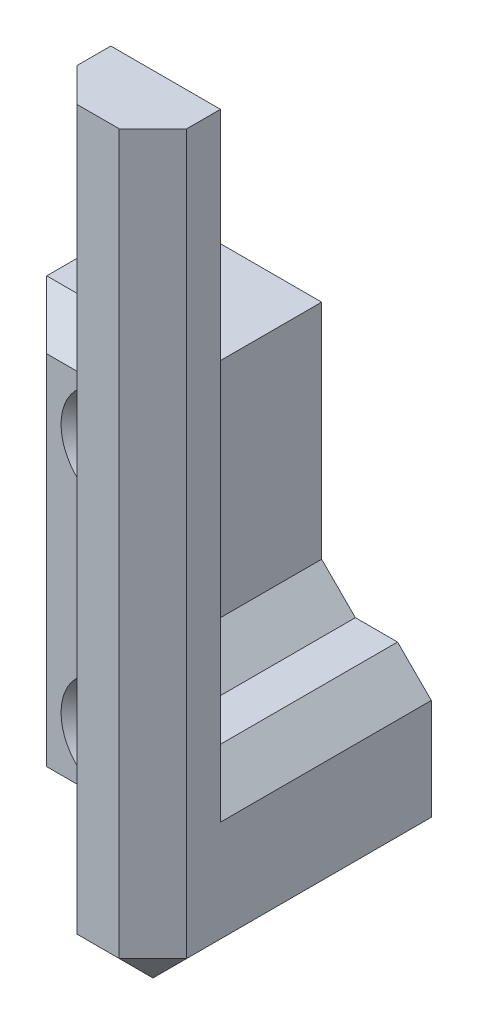
ISO-10303-21;
HEADER;
FILE_DESCRIPTION(('STEP AP214'),'2;1');
FILE_NAME('part.step','',(''),(''),'','','');
FILE_SCHEMA(('AUTOMOTIVE_DESIGN { 1 0 10303 214 1 1 1 1 }'));
ENDSEC;
DATA;
#1=APPLICATION_CONTEXT('core data for automotive mechanical design processes');
#2=APPLICATION_PROTOCOL_DEFINITION('international standard','automotive_design',2000,#1);
#3=PRODUCT_CONTEXT('',#1,'mechanical');
#4=PRODUCT('Part','Part','',(#3));
#5=PRODUCT_RELATED_PRODUCT_CATEGORY('part','',(#4));
#6=PRODUCT_DEFINITION_FORMATION('','',#4);
#7=PRODUCT_DEFINITION_CONTEXT('part definition',#1,'design');
#8=PRODUCT_DEFINITION('design','',#6,#7);
#9=PRODUCT_DEFINITION_SHAPE('','',#8);
#10=(LENGTH_UNIT() NAMED_UNIT(*) SI_UNIT(.MILLI.,.METRE.));
#11=(NAMED_UNIT(*) PLANE_ANGLE_UNIT() SI_UNIT($,.RADIAN.));
#12=(NAMED_UNIT(*) SI_UNIT($,.STERADIAN.) SOLID_ANGLE_UNIT());
#13=UNCERTAINTY_MEASURE_WITH_UNIT(LENGTH_MEASURE(1.E-05),#10,'distance_accuracy_value','');
#14=(GEOMETRIC_REPRESENTATION_CONTEXT(3) GLOBAL_UNCERTAINTY_ASSIGNED_CONTEXT((#13)) GLOBAL_UNIT_ASSIGNED_CONTEXT((#10,
#11,#12)) REPRESENTATION_CONTEXT('',''));
#15=CARTESIAN_POINT('',(0.,0.,0.));
#16=DIRECTION('',(0.,0.,1.));
#17=DIRECTION('',(1.,0.,0.));
#18=AXIS2_PLACEMENT_3D('',#15,#16,#17);
#19=CARTESIAN_POINT('',(9.5,0.,8.8));
#20=DIRECTION('',(-1.,0.,0.));
#21=DIRECTION('',(0.,0.,1.));
#22=AXIS2_PLACEMENT_3D('',#19,#20,#21);
#23=PLANE('',#22);
#24=DIRECTION('',(0.,1.,0.));
#25=VECTOR('',#24,1.);
#26=CARTESIAN_POINT('',(9.5,0.,8.8));
#27=LINE('',#26,#25);
#28=CARTESIAN_POINT('',(9.5,12.,8.8));
#29=VERTEX_POINT('',#28);
#30=CARTESIAN_POINT('',(9.5,23.2,8.8));
#31=VERTEX_POINT('',#30);
#32=EDGE_CURVE('E234',#29,#31,#27,.T.);
#33=ORIENTED_EDGE('',*,*,#32,.F.);
#34=DIRECTION('',(0.,0.,-1.));
#35=VECTOR('',#34,1.);
#36=CARTESIAN_POINT('',(9.5,12.,8.8));
#37=LINE('',#36,#35);
#38=CARTESIAN_POINT('',(9.5,12.,0.));
#39=VERTEX_POINT('',#38);
#40=EDGE_CURVE('E272',#29,#39,#37,.T.);
#41=ORIENTED_EDGE('',*,*,#40,.T.);
#42=DIRECTION('',(0.,1.,0.));
#43=VECTOR('',#42,1.);
#44=CARTESIAN_POINT('',(9.5,0.,0.));
#45=LINE('',#44,#43);
#46=CARTESIAN_POINT('',(9.5,25.2,0.));
#47=VERTEX_POINT('',#46);
#48=EDGE_CURVE('E242',#39,#47,#45,.T.);
#49=ORIENTED_EDGE('',*,*,#48,.T.);
#50=DIRECTION('',(0.,0.,-1.));
#51=VECTOR('',#50,1.);
#52=CARTESIAN_POINT('',(9.5,25.2,8.8));
#53=LINE('',#52,#51);
#54=CARTESIAN_POINT('',(9.5,25.2,6.79999999999999));
#55=VERTEX_POINT('',#54);
#56=EDGE_CURVE('E252',#55,#47,#53,.T.);
#57=ORIENTED_EDGE('',*,*,#56,.F.);
#58=DIRECTION('',(0.,0.707106781186546,-0.707106781186549));
#59=VECTOR('',#58,1.);
#60=CARTESIAN_POINT('',(9.5,23.2,8.8));
#61=LINE('',#60,#59);
#62=EDGE_CURVE('E269',#55,#31,#61,.F.);
#63=ORIENTED_EDGE('',*,*,#62,.T.);
#64=EDGE_LOOP('',(#33,#41,#49,#57,#63));
#65=FACE_BOUND('',#64,.T.);
#66=ADVANCED_FACE('F47',(#65),#23,.F.);
#67=CARTESIAN_POINT('',(0.,0.,8.8));
#68=DIRECTION('',(0.,0.,-1.));
#69=DIRECTION('',(-1.,0.,0.));
#70=AXIS2_PLACEMENT_3D('',#67,#68,#69);
#71=PLANE('',#70);
#72=CARTESIAN_POINT('',(6.,5.2,8.8));
#73=DIRECTION('',(0.,0.,-1.));
#74=DIRECTION('',(-1.,0.,0.));
#75=AXIS2_PLACEMENT_3D('',#72,#73,#74);
#76=CIRCLE('',#75,3.15000000000001);
#77=CARTESIAN_POINT('',(2.84999999999999,5.2,8.8));
#78=VERTEX_POINT('',#77);
#79=EDGE_CURVE('E57',#78,#78,#76,.T.);
#80=ORIENTED_EDGE('',*,*,#79,.T.);
#81=EDGE_LOOP('',(#80));
#82=FACE_BOUND('',#81,.T.);
#83=CARTESIAN_POINT('',(6.,20.,8.8));
#84=DIRECTION('',(0.,0.,-1.));
#85=DIRECTION('',(-1.,0.,0.));
#86=AXIS2_PLACEMENT_3D('',#83,#84,#85);
#87=CIRCLE('',#86,3.15000000000001);
#88=CARTESIAN_POINT('',(2.84999999999999,20.,8.8));
#89=VERTEX_POINT('',#88);
#90=EDGE_CURVE('E383',#89,#89,#87,.T.);
#91=ORIENTED_EDGE('',*,*,#90,.T.);
#92=EDGE_LOOP('',(#91));
#93=FACE_BOUND('',#92,.T.);
#94=ORIENTED_EDGE('',*,*,#32,.T.);
#95=DIRECTION('',(-1.,0.,0.));
#96=VECTOR('',#95,1.);
#97=CARTESIAN_POINT('',(0.,23.2,8.8));
#98=LINE('',#97,#96);
#99=CARTESIAN_POINT('',(2.,23.2,8.8));
#100=VERTEX_POINT('',#99);
#101=EDGE_CURVE('E295',#31,#100,#98,.T.);
#102=ORIENTED_EDGE('',*,*,#101,.T.);
#103=DIRECTION('',(0.,-1.,0.));
#104=VECTOR('',#103,1.);
#105=CARTESIAN_POINT('',(2.,0.,8.8));
#106=LINE('',#105,#104);
#107=CARTESIAN_POINT('',(2.,2.,8.8));
#108=VERTEX_POINT('',#107);
#109=EDGE_CURVE('E289',#100,#108,#106,.T.);
#110=ORIENTED_EDGE('',*,*,#109,.T.);
#111=DIRECTION('',(1.,0.,0.));
#112=VECTOR('',#111,1.);
#113=CARTESIAN_POINT('',(0.,2.,8.8));
#114=LINE('',#113,#112);
#115=CARTESIAN_POINT('',(9.5,2.,8.8));
#116=VERTEX_POINT('',#115);
#117=EDGE_CURVE('E292',#108,#116,#114,.T.);
#118=ORIENTED_EDGE('',*,*,#117,.T.);
#119=CARTESIAN_POINT('',(9.5,10.,8.8));
#120=VERTEX_POINT('',#119);
#121=EDGE_CURVE('E230',#116,#120,#27,.T.);
#122=ORIENTED_EDGE('',*,*,#121,.T.);
#123=DIRECTION('',(-1.,0.,0.));
#124=VECTOR('',#123,1.);
#125=CARTESIAN_POINT('',(9.5,10.,8.8));
#126=LINE('',#125,#124);
#127=CARTESIAN_POINT('',(11.5,10.,8.8));
#128=VERTEX_POINT('',#127);
#129=EDGE_CURVE('E261',#128,#120,#126,.T.);
#130=ORIENTED_EDGE('',*,*,#129,.F.);
#131=DIRECTION('',(-0.707106781186551,0.707106781186544,0.));
#132=VECTOR('',#131,1.);
#133=CARTESIAN_POINT('',(10.7499999999999,10.7500000000001,8.8));
#134=LINE('',#133,#132);
#135=EDGE_CURVE('E335',#128,#29,#134,.T.);
#136=ORIENTED_EDGE('',*,*,#135,.T.);
#137=EDGE_LOOP('',(#94,#102,#110,#118,#122,#130,#136));
#138=FACE_BOUND('',#137,.T.);
#139=ADVANCED_FACE('F390',(#82,#93,#138),#71,.F.);
#140=CARTESIAN_POINT('',(0.,0.,0.));
#141=DIRECTION('',(0.,0.,-1.));
#142=DIRECTION('',(-1.,0.,0.));
#143=AXIS2_PLACEMENT_3D('',#140,#141,#142);
#144=PLANE('',#143);
#145=CARTESIAN_POINT('',(6.,20.,0.));
#146=DIRECTION('',(0.,0.,1.));
#147=DIRECTION('',(1.,0.,0.));
#148=AXIS2_PLACEMENT_3D('',#145,#146,#147);
#149=CIRCLE('',#148,1.6);
#150=CARTESIAN_POINT('',(7.6,20.,0.));
#151=VERTEX_POINT('',#150);
#152=EDGE_CURVE('E225',#151,#151,#149,.T.);
#153=ORIENTED_EDGE('',*,*,#152,.T.);
#154=EDGE_LOOP('',(#153));
#155=FACE_BOUND('',#154,.T.);
#156=DIRECTION('',(-1.,0.,0.));
#157=VECTOR('',#156,1.);
#158=CARTESIAN_POINT('',(9.5,10.,0.));
#159=LINE('',#158,#157);
#160=CARTESIAN_POINT('',(14.,10.,0.));
#161=VERTEX_POINT('',#160);
#162=CARTESIAN_POINT('',(11.5,10.,0.));
#163=VERTEX_POINT('',#162);
#164=EDGE_CURVE('E211',#161,#163,#159,.T.);
#165=ORIENTED_EDGE('',*,*,#164,.F.);
#166=DIRECTION('',(-0.707106781186549,0.707106781186546,0.));
#167=VECTOR('',#166,1.);
#168=CARTESIAN_POINT('',(12.,12.,0.));
#169=LINE('',#168,#167);
#170=CARTESIAN_POINT('',(16.,8.,0.));
#171=VERTEX_POINT('',#170);
#172=EDGE_CURVE('E286',#161,#171,#169,.F.);
#173=ORIENTED_EDGE('',*,*,#172,.T.);
#174=DIRECTION('',(0.,1.,0.));
#175=VECTOR('',#174,1.);
#176=CARTESIAN_POINT('',(16.,0.,0.));
#177=LINE('',#176,#175);
#178=CARTESIAN_POINT('',(16.,2.00000000000001,0.));
#179=VERTEX_POINT('',#178);
#180=EDGE_CURVE('E210',#179,#171,#177,.T.);
#181=ORIENTED_EDGE('',*,*,#180,.F.);
#182=DIRECTION('',(-0.707106781186546,-0.707106781186549,0.));
#183=VECTOR('',#182,1.);
#184=CARTESIAN_POINT('',(7.00000000000002,-7.,0.));
#185=LINE('',#184,#183);
#186=CARTESIAN_POINT('',(14.,0.,0.));
#187=VERTEX_POINT('',#186);
#188=EDGE_CURVE('E283',#179,#187,#185,.T.);
#189=ORIENTED_EDGE('',*,*,#188,.T.);
#190=DIRECTION('',(1.,0.,0.));
#191=VECTOR('',#190,1.);
#192=CARTESIAN_POINT('',(8.,0.,0.));
#193=LINE('',#192,#191);
#194=CARTESIAN_POINT('',(0.,0.,0.));
#195=VERTEX_POINT('',#194);
#196=EDGE_CURVE('E238',#195,#187,#193,.T.);
#197=ORIENTED_EDGE('',*,*,#196,.F.);
#198=DIRECTION('',(0.,-1.,0.));
#199=VECTOR('',#198,1.);
#200=CARTESIAN_POINT('',(0.,0.,0.));
#201=LINE('',#200,#199);
#202=CARTESIAN_POINT('',(0.,25.2,0.));
#203=VERTEX_POINT('',#202);
#204=EDGE_CURVE('E229',#203,#195,#201,.T.);
#205=ORIENTED_EDGE('',*,*,#204,.F.);
#206=DIRECTION('',(-1.,0.,0.));
#207=VECTOR('',#206,1.);
#208=CARTESIAN_POINT('',(0.,25.2,0.));
#209=LINE('',#208,#207);
#210=EDGE_CURVE('E246',#47,#203,#209,.T.);
#211=ORIENTED_EDGE('',*,*,#210,.F.);
#212=ORIENTED_EDGE('',*,*,#48,.F.);
#213=DIRECTION('',(0.707106781186551,-0.707106781186544,0.));
#214=VECTOR('',#213,1.);
#215=CARTESIAN_POINT('',(11.5,10.,0.));
#216=LINE('',#215,#214);
#217=EDGE_CURVE('E338',#39,#163,#216,.T.);
#218=ORIENTED_EDGE('',*,*,#217,.T.);
#219=EDGE_LOOP('',(#165,#173,#181,#189,#197,#205,#211,#212,#218));
#220=FACE_BOUND('',#219,.T.);
#221=CARTESIAN_POINT('',(6.,5.2,0.));
#222=DIRECTION('',(0.,0.,1.));
#223=DIRECTION('',(-1.,0.,0.));
#224=AXIS2_PLACEMENT_3D('',#221,#222,#223);
#225=CIRCLE('',#224,1.6);
#226=CARTESIAN_POINT('',(4.4,5.2,0.));
#227=VERTEX_POINT('',#226);
#228=EDGE_CURVE('E221',#227,#227,#225,.T.);
#229=ORIENTED_EDGE('',*,*,#228,.T.);
#230=EDGE_LOOP('',(#229));
#231=FACE_BOUND('',#230,.T.);
#232=ADVANCED_FACE('F407',(#155,#220,#231),#144,.T.);
#233=CARTESIAN_POINT('',(0.,0.,8.8));
#234=DIRECTION('',(1.,0.,0.));
#235=DIRECTION('',(0.,0.,-1.));
#236=AXIS2_PLACEMENT_3D('',#233,#234,#235);
#237=PLANE('',#236);
#238=DIRECTION('',(0.,0.,-1.));
#239=VECTOR('',#238,1.);
#240=CARTESIAN_POINT('',(0.,0.,8.8));
#241=LINE('',#240,#239);
#242=CARTESIAN_POINT('',(0.,0.,6.79999999999999));
#243=VERTEX_POINT('',#242);
#244=EDGE_CURVE('E255',#243,#195,#241,.T.);
#245=ORIENTED_EDGE('',*,*,#244,.F.);
#246=DIRECTION('',(0.,1.,0.));
#247=VECTOR('',#246,1.);
#248=CARTESIAN_POINT('',(0.,0.,6.79999999999999));
#249=LINE('',#248,#247);
#250=CARTESIAN_POINT('',(0.,25.2,6.79999999999999));
#251=VERTEX_POINT('',#250);
#252=EDGE_CURVE('E332',#243,#251,#249,.T.);
#253=ORIENTED_EDGE('',*,*,#252,.T.);
#254=DIRECTION('',(0.,0.,-1.));
#255=VECTOR('',#254,1.);
#256=CARTESIAN_POINT('',(0.,25.2,8.8));
#257=LINE('',#256,#255);
#258=EDGE_CURVE('E233',#251,#203,#257,.T.);
#259=ORIENTED_EDGE('',*,*,#258,.T.);
#260=ORIENTED_EDGE('',*,*,#204,.T.);
#261=EDGE_LOOP('',(#245,#253,#259,#260));
#262=FACE_BOUND('',#261,.T.);
#263=ADVANCED_FACE('F409',(#262),#237,.F.);
#264=CARTESIAN_POINT('',(8.,0.,8.8));
#265=DIRECTION('',(0.,1.,0.));
#266=DIRECTION('',(0.,0.,1.));
#267=AXIS2_PLACEMENT_3D('',#264,#265,#266);
#268=PLANE('',#267);
#269=ORIENTED_EDGE('',*,*,#196,.T.);
#270=DIRECTION('',(0.,0.,1.));
#271=VECTOR('',#270,1.);
#272=CARTESIAN_POINT('',(14.,0.,16.5));
#273=LINE('',#272,#271);
#274=CARTESIAN_POINT('',(14.,0.,14.5));
#275=VERTEX_POINT('',#274);
#276=EDGE_CURVE('E311',#187,#275,#273,.T.);
#277=ORIENTED_EDGE('',*,*,#276,.T.);
#278=DIRECTION('',(-1.,0.,0.));
#279=VECTOR('',#278,1.);
#280=CARTESIAN_POINT('',(8.,0.,14.5));
#281=LINE('',#280,#279);
#282=CARTESIAN_POINT('',(11.5,0.,14.5));
#283=VERTEX_POINT('',#282);
#284=EDGE_CURVE('E308',#275,#283,#281,.T.);
#285=ORIENTED_EDGE('',*,*,#284,.T.);
#286=DIRECTION('',(0.,0.,-1.));
#287=VECTOR('',#286,1.);
#288=CARTESIAN_POINT('',(11.5,0.,8.8));
#289=LINE('',#288,#287);
#290=CARTESIAN_POINT('',(11.5,0.,6.79999999999999));
#291=VERTEX_POINT('',#290);
#292=EDGE_CURVE('E305',#283,#291,#289,.T.);
#293=ORIENTED_EDGE('',*,*,#292,.T.);
#294=DIRECTION('',(-1.,0.,0.));
#295=VECTOR('',#294,1.);
#296=CARTESIAN_POINT('',(8.,0.,6.79999999999999));
#297=LINE('',#296,#295);
#298=EDGE_CURVE('E302',#291,#243,#297,.T.);
#299=ORIENTED_EDGE('',*,*,#298,.T.);
#300=ORIENTED_EDGE('',*,*,#244,.T.);
#301=EDGE_LOOP('',(#269,#277,#285,#293,#299,#300));
#302=FACE_BOUND('',#301,.T.);
#303=ADVANCED_FACE('F416',(#302),#268,.F.);
#304=CARTESIAN_POINT('',(0.,25.2,8.8));
#305=DIRECTION('',(0.,-1.,0.));
#306=DIRECTION('',(0.,0.,-1.));
#307=AXIS2_PLACEMENT_3D('',#304,#305,#306);
#308=PLANE('',#307);
#309=ORIENTED_EDGE('',*,*,#258,.F.);
#310=DIRECTION('',(1.,0.,0.));
#311=VECTOR('',#310,1.);
#312=CARTESIAN_POINT('',(0.,25.2,6.79999999999999));
#313=LINE('',#312,#311);
#314=EDGE_CURVE('E299',#251,#55,#313,.T.);
#315=ORIENTED_EDGE('',*,*,#314,.T.);
#316=ORIENTED_EDGE('',*,*,#56,.T.);
#317=ORIENTED_EDGE('',*,*,#210,.T.);
#318=EDGE_LOOP('',(#309,#315,#316,#317));
#319=FACE_BOUND('',#318,.T.);
#320=ADVANCED_FACE('F429',(#319),#308,.F.);
#321=CARTESIAN_POINT('',(6.,20.,8.8));
#322=DIRECTION('',(0.,0.,-1.));
#323=DIRECTION('',(-1.,0.,0.));
#324=AXIS2_PLACEMENT_3D('',#321,#322,#323);
#325=CYLINDRICAL_SURFACE('',#324,1.6);
#326=CARTESIAN_POINT('',(6.,20.,7.25));
#327=DIRECTION('',(0.,0.,-1.));
#328=DIRECTION('',(-1.,0.,0.));
#329=AXIS2_PLACEMENT_3D('',#326,#327,#328);
#330=CIRCLE('',#329,1.6);
#331=CARTESIAN_POINT('',(4.4,20.,7.25));
#332=VERTEX_POINT('',#331);
#333=EDGE_CURVE('E11',#332,#332,#330,.F.);
#334=ORIENTED_EDGE('',*,*,#333,.T.);
#335=EDGE_LOOP('',(#334));
#336=FACE_BOUND('',#335,.T.);
#337=ORIENTED_EDGE('',*,*,#152,.F.);
#338=EDGE_LOOP('',(#337));
#339=FACE_BOUND('',#338,.T.);
#340=ADVANCED_FACE('F403',(#336,#339),#325,.F.);
#341=CARTESIAN_POINT('',(6.,5.2,8.8));
#342=DIRECTION('',(0.,0.,-1.));
#343=DIRECTION('',(-1.,0.,0.));
#344=AXIS2_PLACEMENT_3D('',#341,#342,#343);
#345=CYLINDRICAL_SURFACE('',#344,1.6);
#346=CARTESIAN_POINT('',(6.,5.2,7.25));
#347=DIRECTION('',(0.,0.,-1.));
#348=DIRECTION('',(-1.,0.,0.));
#349=AXIS2_PLACEMENT_3D('',#346,#347,#348);
#350=CIRCLE('',#349,1.6);
#351=CARTESIAN_POINT('',(4.4,5.2,7.25));
#352=VERTEX_POINT('',#351);
#353=EDGE_CURVE('E344',#352,#352,#350,.F.);
#354=ORIENTED_EDGE('',*,*,#353,.T.);
#355=EDGE_LOOP('',(#354));
#356=FACE_BOUND('',#355,.T.);
#357=ORIENTED_EDGE('',*,*,#228,.F.);
#358=EDGE_LOOP('',(#357));
#359=FACE_BOUND('',#358,.T.);
#360=ADVANCED_FACE('F399',(#356,#359),#345,.F.);
#361=CARTESIAN_POINT('',(9.5,0.,-11.9268604418766));
#362=DIRECTION('',(-1.,0.,0.));
#363=DIRECTION('',(0.,0.,1.));
#364=AXIS2_PLACEMENT_3D('',#361,#362,#363);
#365=PLANE('',#364);
#366=DIRECTION('',(0.,0.,1.));
#367=VECTOR('',#366,1.);
#368=CARTESIAN_POINT('',(9.5,2.,16.5));
#369=LINE('',#368,#367);
#370=CARTESIAN_POINT('',(9.5,2.,14.5));
#371=VERTEX_POINT('',#370);
#372=EDGE_CURVE('E64',#116,#371,#369,.T.);
#373=ORIENTED_EDGE('',*,*,#372,.T.);
#374=DIRECTION('',(0.,1.,0.));
#375=VECTOR('',#374,1.);
#376=CARTESIAN_POINT('',(9.5,44.6,14.5));
#377=LINE('',#376,#375);
#378=CARTESIAN_POINT('',(9.5,44.6,14.5));
#379=VERTEX_POINT('',#378);
#380=EDGE_CURVE('E68',#371,#379,#377,.T.);
#381=ORIENTED_EDGE('',*,*,#380,.T.);
#382=DIRECTION('',(0.,0.,-1.));
#383=VECTOR('',#382,1.);
#384=CARTESIAN_POINT('',(9.5,44.6,16.5));
#385=LINE('',#384,#383);
#386=CARTESIAN_POINT('',(9.5,44.6,12.5));
#387=VERTEX_POINT('',#386);
#388=EDGE_CURVE('E183',#379,#387,#385,.T.);
#389=ORIENTED_EDGE('',*,*,#388,.T.);
#390=DIRECTION('',(0.,-1.,0.));
#391=VECTOR('',#390,1.);
#392=CARTESIAN_POINT('',(9.5,0.,12.5));
#393=LINE('',#392,#391);
#394=CARTESIAN_POINT('',(9.5,10.,12.5));
#395=VERTEX_POINT('',#394);
#396=EDGE_CURVE('E194',#387,#395,#393,.T.);
#397=ORIENTED_EDGE('',*,*,#396,.T.);
#398=DIRECTION('',(0.,0.,1.));
#399=VECTOR('',#398,1.);
#400=CARTESIAN_POINT('',(9.5,10.,-11.9268604418766));
#401=LINE('',#400,#399);
#402=EDGE_CURVE('E215',#120,#395,#401,.T.);
#403=ORIENTED_EDGE('',*,*,#402,.F.);
#404=ORIENTED_EDGE('',*,*,#121,.F.);
#405=EDGE_LOOP('',(#373,#381,#389,#397,#403,#404));
#406=FACE_BOUND('',#405,.T.);
#407=ADVANCED_FACE('F402',(#406),#365,.T.);
#408=CARTESIAN_POINT('',(16.,0.,-11.9268604418766));
#409=DIRECTION('',(1.,0.,0.));
#410=DIRECTION('',(0.,0.,-1.));
#411=AXIS2_PLACEMENT_3D('',#408,#409,#410);
#412=PLANE('',#411);
#413=ORIENTED_EDGE('',*,*,#180,.T.);
#414=DIRECTION('',(0.,0.,1.));
#415=VECTOR('',#414,1.);
#416=CARTESIAN_POINT('',(16.,8.,-11.9268604418766));
#417=LINE('',#416,#415);
#418=CARTESIAN_POINT('',(16.,8.,12.5));
#419=VERTEX_POINT('',#418);
#420=EDGE_CURVE('E190',#171,#419,#417,.T.);
#421=ORIENTED_EDGE('',*,*,#420,.T.);
#422=DIRECTION('',(0.,1.,0.));
#423=VECTOR('',#422,1.);
#424=CARTESIAN_POINT('',(16.,0.,12.5));
#425=LINE('',#424,#423);
#426=CARTESIAN_POINT('',(16.,44.6,12.5));
#427=VERTEX_POINT('',#426);
#428=EDGE_CURVE('E186',#419,#427,#425,.T.);
#429=ORIENTED_EDGE('',*,*,#428,.T.);
#430=DIRECTION('',(0.,0.,-1.));
#431=VECTOR('',#430,1.);
#432=CARTESIAN_POINT('',(16.,44.6,16.5));
#433=LINE('',#432,#431);
#434=CARTESIAN_POINT('',(16.,44.6,14.5));
#435=VERTEX_POINT('',#434);
#436=EDGE_CURVE('E170',#435,#427,#433,.T.);
#437=ORIENTED_EDGE('',*,*,#436,.F.);
#438=DIRECTION('',(0.,-1.,0.));
#439=VECTOR('',#438,1.);
#440=CARTESIAN_POINT('',(16.,0.,14.5));
#441=LINE('',#440,#439);
#442=CARTESIAN_POINT('',(16.,2.00000000000001,14.5));
#443=VERTEX_POINT('',#442);
#444=EDGE_CURVE('E275',#435,#443,#441,.T.);
#445=ORIENTED_EDGE('',*,*,#444,.T.);
#446=DIRECTION('',(0.,0.,-1.));
#447=VECTOR('',#446,1.);
#448=CARTESIAN_POINT('',(16.,2.00000000000001,0.));
#449=LINE('',#448,#447);
#450=EDGE_CURVE('E278',#443,#179,#449,.T.);
#451=ORIENTED_EDGE('',*,*,#450,.T.);
#452=EDGE_LOOP('',(#413,#421,#429,#437,#445,#451));
#453=FACE_BOUND('',#452,.T.);
#454=ADVANCED_FACE('F188',(#453),#412,.T.);
#455=CARTESIAN_POINT('',(9.5,10.,-11.9268604418766));
#456=DIRECTION('',(0.,1.,0.));
#457=DIRECTION('',(0.,0.,1.));
#458=AXIS2_PLACEMENT_3D('',#455,#456,#457);
#459=PLANE('',#458);
#460=ORIENTED_EDGE('',*,*,#164,.T.);
#461=DIRECTION('',(0.,0.,1.));
#462=VECTOR('',#461,1.);
#463=CARTESIAN_POINT('',(11.5,10.,-11.9268604418766));
#464=LINE('',#463,#462);
#465=EDGE_CURVE('E265',#163,#128,#464,.T.);
#466=ORIENTED_EDGE('',*,*,#465,.T.);
#467=ORIENTED_EDGE('',*,*,#129,.T.);
#468=ORIENTED_EDGE('',*,*,#402,.T.);
#469=DIRECTION('',(-1.,0.,0.));
#470=VECTOR('',#469,1.);
#471=CARTESIAN_POINT('',(9.5,10.,12.5));
#472=LINE('',#471,#470);
#473=CARTESIAN_POINT('',(14.,10.,12.5));
#474=VERTEX_POINT('',#473);
#475=EDGE_CURVE('E182',#474,#395,#472,.T.);
#476=ORIENTED_EDGE('',*,*,#475,.F.);
#477=DIRECTION('',(0.,0.,-1.));
#478=VECTOR('',#477,1.);
#479=CARTESIAN_POINT('',(14.,10.,-11.9268604418766));
#480=LINE('',#479,#478);
#481=EDGE_CURVE('E258',#474,#161,#480,.T.);
#482=ORIENTED_EDGE('',*,*,#481,.T.);
#483=EDGE_LOOP('',(#460,#466,#467,#468,#476,#482));
#484=FACE_BOUND('',#483,.T.);
#485=ADVANCED_FACE('F554',(#484),#459,.T.);
#486=CARTESIAN_POINT('',(9.5,44.6,16.5));
#487=DIRECTION('',(0.,-1.,0.));
#488=DIRECTION('',(0.,0.,-1.));
#489=AXIS2_PLACEMENT_3D('',#486,#487,#488);
#490=PLANE('',#489);
#491=DIRECTION('',(-1.,0.,0.));
#492=VECTOR('',#491,1.);
#493=CARTESIAN_POINT('',(9.5,44.6,16.5));
#494=LINE('',#493,#492);
#495=CARTESIAN_POINT('',(14.,44.6,16.5));
#496=VERTEX_POINT('',#495);
#497=CARTESIAN_POINT('',(11.5,44.6,16.5));
#498=VERTEX_POINT('',#497);
#499=EDGE_CURVE('E199',#496,#498,#494,.T.);
#500=ORIENTED_EDGE('',*,*,#499,.F.);
#501=DIRECTION('',(0.707106781186546,0.,-0.707106781186549));
#502=VECTOR('',#501,1.);
#503=CARTESIAN_POINT('',(14.,44.6,16.5));
#504=LINE('',#503,#502);
#505=EDGE_CURVE('E178',#496,#435,#504,.T.);
#506=ORIENTED_EDGE('',*,*,#505,.T.);
#507=ORIENTED_EDGE('',*,*,#436,.T.);
#508=DIRECTION('',(-1.,0.,0.));
#509=VECTOR('',#508,1.);
#510=CARTESIAN_POINT('',(9.5,44.6,12.5));
#511=LINE('',#510,#509);
#512=EDGE_CURVE('E175',#427,#387,#511,.T.);
#513=ORIENTED_EDGE('',*,*,#512,.T.);
#514=ORIENTED_EDGE('',*,*,#388,.F.);
#515=DIRECTION('',(0.707106781186546,0.,0.707106781186549));
#516=VECTOR('',#515,1.);
#517=CARTESIAN_POINT('',(11.5,44.6,16.5));
#518=LINE('',#517,#516);
#519=EDGE_CURVE('E323',#379,#498,#518,.T.);
#520=ORIENTED_EDGE('',*,*,#519,.T.);
#521=EDGE_LOOP('',(#500,#506,#507,#513,#514,#520));
#522=FACE_BOUND('',#521,.T.);
#523=ADVANCED_FACE('F173',(#522),#490,.F.);
#524=CARTESIAN_POINT('',(0.,0.,16.5));
#525=DIRECTION('',(0.,0.,-1.));
#526=DIRECTION('',(-1.,0.,0.));
#527=AXIS2_PLACEMENT_3D('',#524,#525,#526);
#528=PLANE('',#527);
#529=DIRECTION('',(1.,0.,0.));
#530=VECTOR('',#529,1.);
#531=CARTESIAN_POINT('',(0.,2.,16.5));
#532=LINE('',#531,#530);
#533=CARTESIAN_POINT('',(11.5,2.,16.5));
#534=VERTEX_POINT('',#533);
#535=CARTESIAN_POINT('',(14.,2.,16.5));
#536=VERTEX_POINT('',#535);
#537=EDGE_CURVE('E317',#534,#536,#532,.T.);
#538=ORIENTED_EDGE('',*,*,#537,.T.);
#539=DIRECTION('',(0.,1.,0.));
#540=VECTOR('',#539,1.);
#541=CARTESIAN_POINT('',(14.,44.6,16.5));
#542=LINE('',#541,#540);
#543=EDGE_CURVE('E320',#536,#496,#542,.T.);
#544=ORIENTED_EDGE('',*,*,#543,.T.);
#545=ORIENTED_EDGE('',*,*,#499,.T.);
#546=DIRECTION('',(0.,-1.,0.));
#547=VECTOR('',#546,1.);
#548=CARTESIAN_POINT('',(11.5,0.,16.5));
#549=LINE('',#548,#547);
#550=EDGE_CURVE('E314',#498,#534,#549,.T.);
#551=ORIENTED_EDGE('',*,*,#550,.T.);
#552=EDGE_LOOP('',(#538,#544,#545,#551));
#553=FACE_BOUND('',#552,.T.);
#554=ADVANCED_FACE('F565',(#553),#528,.F.);
#555=CARTESIAN_POINT('',(0.,0.,12.5));
#556=DIRECTION('',(0.,0.,-1.));
#557=DIRECTION('',(-1.,0.,0.));
#558=AXIS2_PLACEMENT_3D('',#555,#556,#557);
#559=PLANE('',#558);
#560=ORIENTED_EDGE('',*,*,#428,.F.);
#561=DIRECTION('',(0.707106781186549,-0.707106781186546,0.));
#562=VECTOR('',#561,1.);
#563=CARTESIAN_POINT('',(16.,8.,12.5));
#564=LINE('',#563,#562);
#565=EDGE_CURVE('E341',#419,#474,#564,.F.);
#566=ORIENTED_EDGE('',*,*,#565,.T.);
#567=ORIENTED_EDGE('',*,*,#475,.T.);
#568=ORIENTED_EDGE('',*,*,#396,.F.);
#569=ORIENTED_EDGE('',*,*,#512,.F.);
#570=EDGE_LOOP('',(#560,#566,#567,#568,#569));
#571=FACE_BOUND('',#570,.T.);
#572=ADVANCED_FACE('F196',(#571),#559,.T.);
#573=CARTESIAN_POINT('',(11.5,10.,-11.9268604418766));
#574=DIRECTION('',(-0.707106781186544,-0.707106781186551,0.));
#575=DIRECTION('',(0.,0.,1.));
#576=AXIS2_PLACEMENT_3D('',#573,#574,#575);
#577=PLANE('',#576);
#578=ORIENTED_EDGE('',*,*,#217,.F.);
#579=ORIENTED_EDGE('',*,*,#40,.F.);
#580=ORIENTED_EDGE('',*,*,#135,.F.);
#581=ORIENTED_EDGE('',*,*,#465,.F.);
#582=EDGE_LOOP('',(#578,#579,#580,#581));
#583=FACE_BOUND('',#582,.T.);
#584=ADVANCED_FACE('F434',(#583),#577,.F.);
#585=CARTESIAN_POINT('',(16.,8.,-11.9268604418766));
#586=DIRECTION('',(-0.707106781186546,-0.707106781186549,0.));
#587=DIRECTION('',(0.,0.,1.));
#588=AXIS2_PLACEMENT_3D('',#585,#586,#587);
#589=PLANE('',#588);
#590=ORIENTED_EDGE('',*,*,#172,.F.);
#591=ORIENTED_EDGE('',*,*,#481,.F.);
#592=ORIENTED_EDGE('',*,*,#565,.F.);
#593=ORIENTED_EDGE('',*,*,#420,.F.);
#594=EDGE_LOOP('',(#590,#591,#592,#593));
#595=FACE_BOUND('',#594,.T.);
#596=ADVANCED_FACE('F440',(#595),#589,.F.);
#597=CARTESIAN_POINT('',(14.,0.,16.5));
#598=DIRECTION('',(0.707106781186549,0.,0.707106781186546));
#599=DIRECTION('',(0.,-1.,0.));
#600=AXIS2_PLACEMENT_3D('',#597,#598,#599);
#601=PLANE('',#600);
#602=ORIENTED_EDGE('',*,*,#505,.F.);
#603=ORIENTED_EDGE('',*,*,#543,.F.);
#604=DIRECTION('',(-0.707106781186546,0.,0.707106781186549));
#605=VECTOR('',#604,1.);
#606=CARTESIAN_POINT('',(15.,2.00000000000001,15.5));
#607=LINE('',#606,#605);
#608=EDGE_CURVE('E376',#443,#536,#607,.T.);
#609=ORIENTED_EDGE('',*,*,#608,.F.);
#610=ORIENTED_EDGE('',*,*,#444,.F.);
#611=EDGE_LOOP('',(#602,#603,#609,#610));
#612=FACE_BOUND('',#611,.T.);
#613=ADVANCED_FACE('F447',(#612),#601,.T.);
#614=CARTESIAN_POINT('',(14.,0.,8.8));
#615=DIRECTION('',(0.707106781186549,-0.707106781186546,0.));
#616=DIRECTION('',(0.,0.,-1.));
#617=AXIS2_PLACEMENT_3D('',#614,#615,#616);
#618=PLANE('',#617);
#619=ORIENTED_EDGE('',*,*,#188,.F.);
#620=ORIENTED_EDGE('',*,*,#450,.F.);
#621=DIRECTION('',(0.707106781186546,0.707106781186549,0.));
#622=VECTOR('',#621,1.);
#623=CARTESIAN_POINT('',(14.,0.,14.5));
#624=LINE('',#623,#622);
#625=EDGE_CURVE('E372',#275,#443,#624,.T.);
#626=ORIENTED_EDGE('',*,*,#625,.F.);
#627=ORIENTED_EDGE('',*,*,#276,.F.);
#628=EDGE_LOOP('',(#619,#620,#626,#627));
#629=FACE_BOUND('',#628,.T.);
#630=ADVANCED_FACE('F505',(#629),#618,.T.);
#631=CARTESIAN_POINT('',(14.,0.,14.5));
#632=DIRECTION('',(0.577350269189628,-0.577350269189626,0.577350269189624));
#633=DIRECTION('',(0.707106781186546,0.707106781186549,0.));
#634=AXIS2_PLACEMENT_3D('',#631,#632,#633);
#635=PLANE('',#634);
#636=ORIENTED_EDGE('',*,*,#625,.T.);
#637=ORIENTED_EDGE('',*,*,#608,.T.);
#638=DIRECTION('',(0.,0.707106781186546,0.707106781186549));
#639=VECTOR('',#638,1.);
#640=CARTESIAN_POINT('',(14.,0.,14.5));
#641=LINE('',#640,#639);
#642=EDGE_CURVE('E368',#275,#536,#641,.T.);
#643=ORIENTED_EDGE('',*,*,#642,.F.);
#644=EDGE_LOOP('',(#636,#637,#643));
#645=FACE_BOUND('',#644,.T.);
#646=ADVANCED_FACE('F498',(#645),#635,.T.);
#647=CARTESIAN_POINT('',(11.5,0.,16.5));
#648=DIRECTION('',(-0.707106781186549,0.,0.707106781186546));
#649=DIRECTION('',(0.,1.,0.));
#650=AXIS2_PLACEMENT_3D('',#647,#648,#649);
#651=PLANE('',#650);
#652=ORIENTED_EDGE('',*,*,#519,.F.);
#653=ORIENTED_EDGE('',*,*,#380,.F.);
#654=DIRECTION('',(-0.707106781186546,0.,-0.707106781186549));
#655=VECTOR('',#654,1.);
#656=CARTESIAN_POINT('',(10.5,2.,15.5));
#657=LINE('',#656,#655);
#658=EDGE_CURVE('E364',#534,#371,#657,.T.);
#659=ORIENTED_EDGE('',*,*,#658,.F.);
#660=ORIENTED_EDGE('',*,*,#550,.F.);
#661=EDGE_LOOP('',(#652,#653,#659,#660));
#662=FACE_BOUND('',#661,.T.);
#663=ADVANCED_FACE('F491',(#662),#651,.T.);
#664=CARTESIAN_POINT('',(0.,2.,16.5));
#665=DIRECTION('',(0.,0.707106781186549,-0.707106781186546));
#666=DIRECTION('',(1.,0.,0.));
#667=AXIS2_PLACEMENT_3D('',#664,#665,#666);
#668=PLANE('',#667);
#669=ORIENTED_EDGE('',*,*,#642,.T.);
#670=ORIENTED_EDGE('',*,*,#537,.F.);
#671=DIRECTION('',(0.,-0.707106781186546,-0.707106781186549));
#672=VECTOR('',#671,1.);
#673=CARTESIAN_POINT('',(11.5,0.,14.5));
#674=LINE('',#673,#672);
#675=EDGE_CURVE('E360',#283,#534,#674,.F.);
#676=ORIENTED_EDGE('',*,*,#675,.F.);
#677=ORIENTED_EDGE('',*,*,#284,.F.);
#678=EDGE_LOOP('',(#669,#670,#676,#677));
#679=FACE_BOUND('',#678,.T.);
#680=ADVANCED_FACE('F484',(#679),#668,.F.);
#681=CARTESIAN_POINT('',(11.5,0.,14.5));
#682=DIRECTION('',(-0.577350269189626,-0.577350269189628,0.577350269189624));
#683=DIRECTION('',(0.707106781186548,-0.707106781186547,0.));
#684=AXIS2_PLACEMENT_3D('',#681,#682,#683);
#685=PLANE('',#684);
#686=ORIENTED_EDGE('',*,*,#675,.T.);
#687=ORIENTED_EDGE('',*,*,#658,.T.);
#688=DIRECTION('',(0.707106781186549,-0.707106781186546,0.));
#689=VECTOR('',#688,1.);
#690=CARTESIAN_POINT('',(11.5,0.,14.5));
#691=LINE('',#690,#689);
#692=EDGE_CURVE('E356',#283,#371,#691,.F.);
#693=ORIENTED_EDGE('',*,*,#692,.F.);
#694=EDGE_LOOP('',(#686,#687,#693));
#695=FACE_BOUND('',#694,.T.);
#696=ADVANCED_FACE('F477',(#695),#685,.T.);
#697=CARTESIAN_POINT('',(9.5,2.,-11.9268604418766));
#698=DIRECTION('',(-0.707106781186546,-0.707106781186549,0.));
#699=DIRECTION('',(0.,0.,-1.));
#700=AXIS2_PLACEMENT_3D('',#697,#698,#699);
#701=PLANE('',#700);
#702=ORIENTED_EDGE('',*,*,#692,.T.);
#703=ORIENTED_EDGE('',*,*,#372,.F.);
#704=DIRECTION('',(0.577350269189626,-0.577350269189624,-0.577350269189626));
#705=VECTOR('',#704,1.);
#706=CARTESIAN_POINT('',(16.4089534806255,-4.90895348062551,1.89104651937446));
#707=LINE('',#706,#705);
#708=EDGE_CURVE('E352',#291,#116,#707,.F.);
#709=ORIENTED_EDGE('',*,*,#708,.F.);
#710=ORIENTED_EDGE('',*,*,#292,.F.);
#711=EDGE_LOOP('',(#702,#703,#709,#710));
#712=FACE_BOUND('',#711,.T.);
#713=ADVANCED_FACE('F470',(#712),#701,.T.);
#714=CARTESIAN_POINT('',(0.,2.,8.8));
#715=DIRECTION('',(0.,0.707106781186549,-0.707106781186546));
#716=DIRECTION('',(1.,0.,0.));
#717=AXIS2_PLACEMENT_3D('',#714,#715,#716);
#718=PLANE('',#717);
#719=ORIENTED_EDGE('',*,*,#708,.T.);
#720=ORIENTED_EDGE('',*,*,#117,.F.);
#721=DIRECTION('',(0.577350269189625,0.577350269189625,0.577350269189627));
#722=VECTOR('',#721,1.);
#723=CARTESIAN_POINT('',(1.33333333333334,1.33333333333334,8.13333333333333));
#724=LINE('',#723,#722);
#725=EDGE_CURVE('E348',#243,#108,#724,.T.);
#726=ORIENTED_EDGE('',*,*,#725,.F.);
#727=ORIENTED_EDGE('',*,*,#298,.F.);
#728=EDGE_LOOP('',(#719,#720,#726,#727));
#729=FACE_BOUND('',#728,.T.);
#730=ADVANCED_FACE('F463',(#729),#718,.F.);
#731=CARTESIAN_POINT('',(2.,0.,8.8));
#732=DIRECTION('',(0.707106781186549,0.,-0.707106781186546));
#733=DIRECTION('',(0.,-1.,0.));
#734=AXIS2_PLACEMENT_3D('',#731,#732,#733);
#735=PLANE('',#734);
#736=ORIENTED_EDGE('',*,*,#725,.T.);
#737=ORIENTED_EDGE('',*,*,#109,.F.);
#738=DIRECTION('',(-0.577350269189625,0.577350269189625,-0.577350269189627));
#739=VECTOR('',#738,1.);
#740=CARTESIAN_POINT('',(9.73333333333332,15.4666666666667,16.5333333333333));
#741=LINE('',#740,#739);
#742=EDGE_CURVE('E345',#251,#100,#741,.F.);
#743=ORIENTED_EDGE('',*,*,#742,.F.);
#744=ORIENTED_EDGE('',*,*,#252,.F.);
#745=EDGE_LOOP('',(#736,#737,#743,#744));
#746=FACE_BOUND('',#745,.T.);
#747=ADVANCED_FACE('F456',(#746),#735,.F.);
#748=CARTESIAN_POINT('',(0.,23.2,8.8));
#749=DIRECTION('',(0.,-0.707106781186549,-0.707106781186546));
#750=DIRECTION('',(-1.,0.,0.));
#751=AXIS2_PLACEMENT_3D('',#748,#749,#750);
#752=PLANE('',#751);
#753=ORIENTED_EDGE('',*,*,#62,.F.);
#754=ORIENTED_EDGE('',*,*,#314,.F.);
#755=ORIENTED_EDGE('',*,*,#742,.T.);
#756=ORIENTED_EDGE('',*,*,#101,.F.);
#757=EDGE_LOOP('',(#753,#754,#755,#756));
#758=FACE_BOUND('',#757,.T.);
#759=ADVANCED_FACE('F396',(#758),#752,.F.);
#760=CARTESIAN_POINT('',(6.,5.2,7.25));
#761=DIRECTION('',(0.,0.,1.));
#762=DIRECTION('',(1.,0.,0.));
#763=AXIS2_PLACEMENT_3D('',#760,#761,#762);
#764=CONICAL_SURFACE('',#763,1.6,0.785398163397451);
#765=ORIENTED_EDGE('',*,*,#79,.F.);
#766=EDGE_LOOP('',(#765));
#767=FACE_BOUND('',#766,.T.);
#768=ORIENTED_EDGE('',*,*,#353,.F.);
#769=EDGE_LOOP('',(#768));
#770=FACE_BOUND('',#769,.T.);
#771=ADVANCED_FACE('F393',(#767,#770),#764,.F.);
#772=CARTESIAN_POINT('',(6.,20.,7.25));
#773=DIRECTION('',(0.,0.,1.));
#774=DIRECTION('',(1.,0.,0.));
#775=AXIS2_PLACEMENT_3D('',#772,#773,#774);
#776=CONICAL_SURFACE('',#775,1.6,0.785398163397451);
#777=ORIENTED_EDGE('',*,*,#90,.F.);
#778=EDGE_LOOP('',(#777));
#779=FACE_BOUND('',#778,.T.);
#780=ORIENTED_EDGE('',*,*,#333,.F.);
#781=EDGE_LOOP('',(#780));
#782=FACE_BOUND('',#781,.T.);
#783=ADVANCED_FACE('F50',(#779,#782),#776,.F.);
#784=CLOSED_SHELL('',(#66,#139,#232,#263,#303,#320,#340,#360,#407,#454,#485,#523,#554,#572,#584,
#596,#613,#630,#646,#663,#680,#696,#713,#730,#747,#759,#771,#783));
#785=MANIFOLD_SOLID_BREP('B2',#784);
#786=ADVANCED_BREP_SHAPE_REPRESENTATION('',(#18,#785),#14);
#787=SHAPE_DEFINITION_REPRESENTATION(#9,#786);
ENDSEC;
END-ISO-10303-21;
